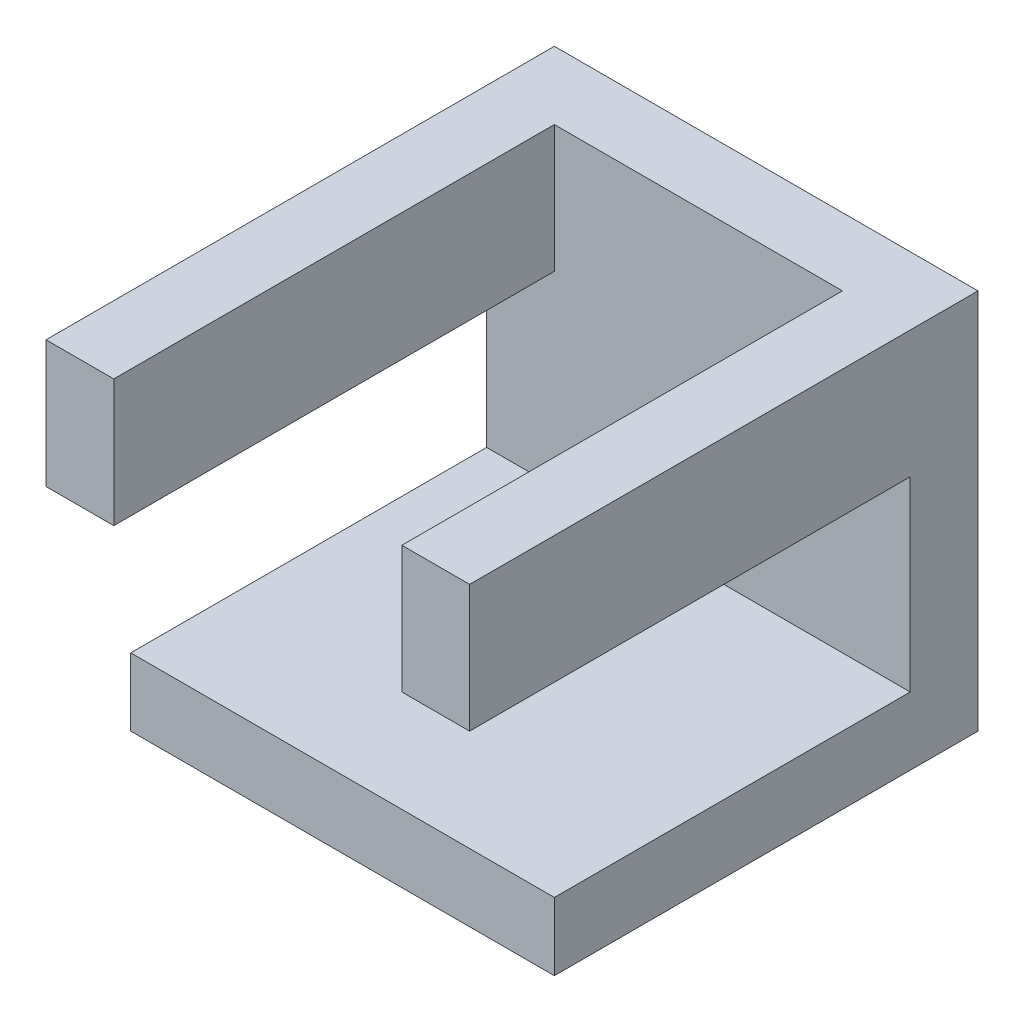
ISO-10303-21;
HEADER;
FILE_DESCRIPTION(('STEP AP214'),'2;1');
FILE_NAME('part.step','',(''),(''),'','','');
FILE_SCHEMA(('AUTOMOTIVE_DESIGN { 1 0 10303 214 1 1 1 1 }'));
ENDSEC;
DATA;
#1=APPLICATION_CONTEXT('core data for automotive mechanical design processes');
#2=APPLICATION_PROTOCOL_DEFINITION('international standard','automotive_design',2000,#1);
#3=PRODUCT_CONTEXT('',#1,'mechanical');
#4=PRODUCT('Part','Part','',(#3));
#5=PRODUCT_RELATED_PRODUCT_CATEGORY('part','',(#4));
#6=PRODUCT_DEFINITION_FORMATION('','',#4);
#7=PRODUCT_DEFINITION_CONTEXT('part definition',#1,'design');
#8=PRODUCT_DEFINITION('design','',#6,#7);
#9=PRODUCT_DEFINITION_SHAPE('','',#8);
#10=(LENGTH_UNIT() NAMED_UNIT(*) SI_UNIT(.MILLI.,.METRE.));
#11=(NAMED_UNIT(*) PLANE_ANGLE_UNIT() SI_UNIT($,.RADIAN.));
#12=(NAMED_UNIT(*) SI_UNIT($,.STERADIAN.) SOLID_ANGLE_UNIT());
#13=UNCERTAINTY_MEASURE_WITH_UNIT(LENGTH_MEASURE(1.E-05),#10,'distance_accuracy_value','');
#14=(GEOMETRIC_REPRESENTATION_CONTEXT(3) GLOBAL_UNCERTAINTY_ASSIGNED_CONTEXT((#13)) GLOBAL_UNIT_ASSIGNED_CONTEXT((#10,
#11,#12)) REPRESENTATION_CONTEXT('',''));
#15=CARTESIAN_POINT('',(0.,0.,0.));
#16=DIRECTION('',(0.,0.,1.));
#17=DIRECTION('',(1.,0.,0.));
#18=AXIS2_PLACEMENT_3D('',#15,#16,#17);
#19=CARTESIAN_POINT('',(0.,0.,80.));
#20=DIRECTION('',(0.,0.,-1.));
#21=DIRECTION('',(-1.,0.,0.));
#22=AXIS2_PLACEMENT_3D('',#19,#20,#21);
#23=PLANE('',#22);
#24=DIRECTION('',(0.,-1.,0.));
#25=VECTOR('',#24,1.);
#26=CARTESIAN_POINT('',(170.,0.,80.));
#27=LINE('',#26,#25);
#28=CARTESIAN_POINT('',(170.,225.,80.));
#29=VERTEX_POINT('',#28);
#30=CARTESIAN_POINT('',(170.,75.,80.));
#31=VERTEX_POINT('',#30);
#32=EDGE_CURVE('E60',#29,#31,#27,.T.);
#33=ORIENTED_EDGE('',*,*,#32,.F.);
#34=DIRECTION('',(-1.,0.,0.));
#35=VECTOR('',#34,1.);
#36=CARTESIAN_POINT('',(-250.,225.,80.));
#37=LINE('',#36,#35);
#38=CARTESIAN_POINT('',(-170.,225.,80.));
#39=VERTEX_POINT('',#38);
#40=EDGE_CURVE('E208',#29,#39,#37,.T.);
#41=ORIENTED_EDGE('',*,*,#40,.T.);
#42=DIRECTION('',(0.,1.,0.));
#43=VECTOR('',#42,1.);
#44=CARTESIAN_POINT('',(-170.,0.,80.));
#45=LINE('',#44,#43);
#46=CARTESIAN_POINT('',(-170.,75.,80.));
#47=VERTEX_POINT('',#46);
#48=EDGE_CURVE('E183',#47,#39,#45,.T.);
#49=ORIENTED_EDGE('',*,*,#48,.F.);
#50=DIRECTION('',(1.,0.,0.));
#51=VECTOR('',#50,1.);
#52=CARTESIAN_POINT('',(0.,75.,80.));
#53=LINE('',#52,#51);
#54=CARTESIAN_POINT('',(-250.,75.,80.));
#55=VERTEX_POINT('',#54);
#56=EDGE_CURVE('E180',#55,#47,#53,.T.);
#57=ORIENTED_EDGE('',*,*,#56,.F.);
#58=DIRECTION('',(0.,-1.,0.));
#59=VECTOR('',#58,1.);
#60=CARTESIAN_POINT('',(-250.,-225.,80.));
#61=LINE('',#60,#59);
#62=CARTESIAN_POINT('',(-250.,-145.,80.));
#63=VERTEX_POINT('',#62);
#64=EDGE_CURVE('E211',#55,#63,#61,.T.);
#65=ORIENTED_EDGE('',*,*,#64,.T.);
#66=DIRECTION('',(-1.,0.,0.));
#67=VECTOR('',#66,1.);
#68=CARTESIAN_POINT('',(0.,-145.,80.));
#69=LINE('',#68,#67);
#70=CARTESIAN_POINT('',(250.,-145.,80.));
#71=VERTEX_POINT('',#70);
#72=EDGE_CURVE('E203',#71,#63,#69,.T.);
#73=ORIENTED_EDGE('',*,*,#72,.F.);
#74=DIRECTION('',(0.,1.,0.));
#75=VECTOR('',#74,1.);
#76=CARTESIAN_POINT('',(250.,-225.,80.));
#77=LINE('',#76,#75);
#78=CARTESIAN_POINT('',(250.,75.,80.));
#79=VERTEX_POINT('',#78);
#80=EDGE_CURVE('E206',#71,#79,#77,.T.);
#81=ORIENTED_EDGE('',*,*,#80,.T.);
#82=DIRECTION('',(1.,0.,0.));
#83=VECTOR('',#82,1.);
#84=CARTESIAN_POINT('',(0.,75.,80.));
#85=LINE('',#84,#83);
#86=EDGE_CURVE('E56',#31,#79,#85,.T.);
#87=ORIENTED_EDGE('',*,*,#86,.F.);
#88=EDGE_LOOP('',(#33,#41,#49,#57,#65,#73,#81,#87));
#89=FACE_BOUND('',#88,.T.);
#90=ADVANCED_FACE('F41',(#89),#23,.F.);
#91=CARTESIAN_POINT('',(250.,-225.,80.));
#92=DIRECTION('',(-1.,0.,0.));
#93=DIRECTION('',(0.,0.,1.));
#94=AXIS2_PLACEMENT_3D('',#91,#92,#93);
#95=PLANE('',#94);
#96=DIRECTION('',(0.,0.,-1.));
#97=VECTOR('',#96,1.);
#98=CARTESIAN_POINT('',(250.,225.,80.));
#99=LINE('',#98,#97);
#100=CARTESIAN_POINT('',(250.,225.,600.));
#101=VERTEX_POINT('',#100);
#102=CARTESIAN_POINT('',(250.,225.,0.));
#103=VERTEX_POINT('',#102);
#104=EDGE_CURVE('E11',#101,#103,#99,.T.);
#105=ORIENTED_EDGE('',*,*,#104,.F.);
#106=DIRECTION('',(0.,1.,0.));
#107=VECTOR('',#106,1.);
#108=CARTESIAN_POINT('',(250.,75.,600.));
#109=LINE('',#108,#107);
#110=CARTESIAN_POINT('',(250.,75.,600.));
#111=VERTEX_POINT('',#110);
#112=EDGE_CURVE('E130',#111,#101,#109,.T.);
#113=ORIENTED_EDGE('',*,*,#112,.F.);
#114=DIRECTION('',(0.,0.,-1.));
#115=VECTOR('',#114,1.);
#116=CARTESIAN_POINT('',(250.,75.,600.));
#117=LINE('',#116,#115);
#118=EDGE_CURVE('E153',#111,#79,#117,.T.);
#119=ORIENTED_EDGE('',*,*,#118,.T.);
#120=ORIENTED_EDGE('',*,*,#80,.F.);
#121=DIRECTION('',(0.,0.,-1.));
#122=VECTOR('',#121,1.);
#123=CARTESIAN_POINT('',(250.,-145.,500.));
#124=LINE('',#123,#122);
#125=CARTESIAN_POINT('',(250.,-145.,500.));
#126=VERTEX_POINT('',#125);
#127=EDGE_CURVE('E200',#126,#71,#124,.T.);
#128=ORIENTED_EDGE('',*,*,#127,.F.);
#129=DIRECTION('',(0.,1.,0.));
#130=VECTOR('',#129,1.);
#131=CARTESIAN_POINT('',(250.,-225.,500.));
#132=LINE('',#131,#130);
#133=CARTESIAN_POINT('',(250.,-225.,500.));
#134=VERTEX_POINT('',#133);
#135=EDGE_CURVE('E186',#134,#126,#132,.T.);
#136=ORIENTED_EDGE('',*,*,#135,.F.);
#137=DIRECTION('',(0.,0.,-1.));
#138=VECTOR('',#137,1.);
#139=CARTESIAN_POINT('',(250.,-225.,80.));
#140=LINE('',#139,#138);
#141=CARTESIAN_POINT('',(250.,-225.,0.));
#142=VERTEX_POINT('',#141);
#143=EDGE_CURVE('E213',#134,#142,#140,.T.);
#144=ORIENTED_EDGE('',*,*,#143,.T.);
#145=DIRECTION('',(0.,1.,0.));
#146=VECTOR('',#145,1.);
#147=CARTESIAN_POINT('',(250.,-225.,0.));
#148=LINE('',#147,#146);
#149=EDGE_CURVE('E133',#142,#103,#148,.T.);
#150=ORIENTED_EDGE('',*,*,#149,.T.);
#151=EDGE_LOOP('',(#105,#113,#119,#120,#128,#136,#144,#150));
#152=FACE_BOUND('',#151,.T.);
#153=ADVANCED_FACE('F43',(#152),#95,.F.);
#154=CARTESIAN_POINT('',(-250.,225.,80.));
#155=DIRECTION('',(0.,-1.,0.));
#156=DIRECTION('',(0.,0.,-1.));
#157=AXIS2_PLACEMENT_3D('',#154,#155,#156);
#158=PLANE('',#157);
#159=DIRECTION('',(-1.,0.,0.));
#160=VECTOR('',#159,1.);
#161=CARTESIAN_POINT('',(-250.,225.,0.));
#162=LINE('',#161,#160);
#163=CARTESIAN_POINT('',(-250.,225.,0.));
#164=VERTEX_POINT('',#163);
#165=EDGE_CURVE('E215',#103,#164,#162,.T.);
#166=ORIENTED_EDGE('',*,*,#165,.T.);
#167=DIRECTION('',(0.,0.,-1.));
#168=VECTOR('',#167,1.);
#169=CARTESIAN_POINT('',(-250.,225.,80.));
#170=LINE('',#169,#168);
#171=CARTESIAN_POINT('',(-250.,225.,600.));
#172=VERTEX_POINT('',#171);
#173=EDGE_CURVE('E49',#172,#164,#170,.T.);
#174=ORIENTED_EDGE('',*,*,#173,.F.);
#175=DIRECTION('',(-1.,0.,0.));
#176=VECTOR('',#175,1.);
#177=CARTESIAN_POINT('',(-250.,225.,600.));
#178=LINE('',#177,#176);
#179=CARTESIAN_POINT('',(-170.,225.,600.));
#180=VERTEX_POINT('',#179);
#181=EDGE_CURVE('E164',#180,#172,#178,.T.);
#182=ORIENTED_EDGE('',*,*,#181,.F.);
#183=DIRECTION('',(0.,0.,-1.));
#184=VECTOR('',#183,1.);
#185=CARTESIAN_POINT('',(-170.,225.,600.));
#186=LINE('',#185,#184);
#187=EDGE_CURVE('E177',#180,#39,#186,.T.);
#188=ORIENTED_EDGE('',*,*,#187,.T.);
#189=ORIENTED_EDGE('',*,*,#40,.F.);
#190=DIRECTION('',(0.,0.,-1.));
#191=VECTOR('',#190,1.);
#192=CARTESIAN_POINT('',(170.,225.,600.));
#193=LINE('',#192,#191);
#194=CARTESIAN_POINT('',(170.,225.,600.));
#195=VERTEX_POINT('',#194);
#196=EDGE_CURVE('E140',#195,#29,#193,.T.);
#197=ORIENTED_EDGE('',*,*,#196,.F.);
#198=DIRECTION('',(-1.,0.,0.));
#199=VECTOR('',#198,1.);
#200=CARTESIAN_POINT('',(170.,225.,600.));
#201=LINE('',#200,#199);
#202=EDGE_CURVE('E137',#101,#195,#201,.T.);
#203=ORIENTED_EDGE('',*,*,#202,.F.);
#204=ORIENTED_EDGE('',*,*,#104,.T.);
#205=EDGE_LOOP('',(#166,#174,#182,#188,#189,#197,#203,#204));
#206=FACE_BOUND('',#205,.T.);
#207=ADVANCED_FACE('F138',(#206),#158,.F.);
#208=CARTESIAN_POINT('',(-250.,-225.,80.));
#209=DIRECTION('',(1.,0.,0.));
#210=DIRECTION('',(0.,0.,-1.));
#211=AXIS2_PLACEMENT_3D('',#208,#209,#210);
#212=PLANE('',#211);
#213=DIRECTION('',(0.,-1.,0.));
#214=VECTOR('',#213,1.);
#215=CARTESIAN_POINT('',(-250.,-225.,0.));
#216=LINE('',#215,#214);
#217=CARTESIAN_POINT('',(-250.,-225.,0.));
#218=VERTEX_POINT('',#217);
#219=EDGE_CURVE('E217',#164,#218,#216,.T.);
#220=ORIENTED_EDGE('',*,*,#219,.T.);
#221=DIRECTION('',(0.,0.,-1.));
#222=VECTOR('',#221,1.);
#223=CARTESIAN_POINT('',(-250.,-225.,80.));
#224=LINE('',#223,#222);
#225=CARTESIAN_POINT('',(-250.,-225.,500.));
#226=VERTEX_POINT('',#225);
#227=EDGE_CURVE('E221',#226,#218,#224,.T.);
#228=ORIENTED_EDGE('',*,*,#227,.F.);
#229=DIRECTION('',(0.,-1.,0.));
#230=VECTOR('',#229,1.);
#231=CARTESIAN_POINT('',(-250.,-225.,500.));
#232=LINE('',#231,#230);
#233=CARTESIAN_POINT('',(-250.,-145.,500.));
#234=VERTEX_POINT('',#233);
#235=EDGE_CURVE('E191',#234,#226,#232,.T.);
#236=ORIENTED_EDGE('',*,*,#235,.F.);
#237=DIRECTION('',(0.,0.,-1.));
#238=VECTOR('',#237,1.);
#239=CARTESIAN_POINT('',(-250.,-145.,500.));
#240=LINE('',#239,#238);
#241=EDGE_CURVE('E197',#234,#63,#240,.T.);
#242=ORIENTED_EDGE('',*,*,#241,.T.);
#243=ORIENTED_EDGE('',*,*,#64,.F.);
#244=DIRECTION('',(0.,0.,-1.));
#245=VECTOR('',#244,1.);
#246=CARTESIAN_POINT('',(-250.,75.,600.));
#247=LINE('',#246,#245);
#248=CARTESIAN_POINT('',(-250.,75.,600.));
#249=VERTEX_POINT('',#248);
#250=EDGE_CURVE('E174',#249,#55,#247,.T.);
#251=ORIENTED_EDGE('',*,*,#250,.F.);
#252=DIRECTION('',(0.,-1.,0.));
#253=VECTOR('',#252,1.);
#254=CARTESIAN_POINT('',(-250.,75.,600.));
#255=LINE('',#254,#253);
#256=EDGE_CURVE('E167',#172,#249,#255,.T.);
#257=ORIENTED_EDGE('',*,*,#256,.F.);
#258=ORIENTED_EDGE('',*,*,#173,.T.);
#259=EDGE_LOOP('',(#220,#228,#236,#242,#243,#251,#257,#258));
#260=FACE_BOUND('',#259,.T.);
#261=ADVANCED_FACE('F227',(#260),#212,.F.);
#262=CARTESIAN_POINT('',(-250.,-225.,80.));
#263=DIRECTION('',(0.,1.,0.));
#264=DIRECTION('',(0.,0.,1.));
#265=AXIS2_PLACEMENT_3D('',#262,#263,#264);
#266=PLANE('',#265);
#267=DIRECTION('',(1.,0.,0.));
#268=VECTOR('',#267,1.);
#269=CARTESIAN_POINT('',(-250.,-225.,0.));
#270=LINE('',#269,#268);
#271=EDGE_CURVE('E209',#218,#142,#270,.T.);
#272=ORIENTED_EDGE('',*,*,#271,.T.);
#273=ORIENTED_EDGE('',*,*,#143,.F.);
#274=DIRECTION('',(1.,0.,0.));
#275=VECTOR('',#274,1.);
#276=CARTESIAN_POINT('',(-250.,-225.,500.));
#277=LINE('',#276,#275);
#278=EDGE_CURVE('E194',#226,#134,#277,.T.);
#279=ORIENTED_EDGE('',*,*,#278,.F.);
#280=ORIENTED_EDGE('',*,*,#227,.T.);
#281=EDGE_LOOP('',(#272,#273,#279,#280));
#282=FACE_BOUND('',#281,.T.);
#283=ADVANCED_FACE('F233',(#282),#266,.F.);
#284=CARTESIAN_POINT('',(0.,0.,0.));
#285=DIRECTION('',(0.,0.,-1.));
#286=DIRECTION('',(-1.,0.,0.));
#287=AXIS2_PLACEMENT_3D('',#284,#285,#286);
#288=PLANE('',#287);
#289=ORIENTED_EDGE('',*,*,#219,.F.);
#290=ORIENTED_EDGE('',*,*,#165,.F.);
#291=ORIENTED_EDGE('',*,*,#149,.F.);
#292=ORIENTED_EDGE('',*,*,#271,.F.);
#293=EDGE_LOOP('',(#289,#290,#291,#292));
#294=FACE_BOUND('',#293,.T.);
#295=ADVANCED_FACE('F231',(#294),#288,.T.);
#296=CARTESIAN_POINT('',(-250.,-145.,500.));
#297=DIRECTION('',(0.,-1.,0.));
#298=DIRECTION('',(0.,0.,-1.));
#299=AXIS2_PLACEMENT_3D('',#296,#297,#298);
#300=PLANE('',#299);
#301=ORIENTED_EDGE('',*,*,#127,.T.);
#302=ORIENTED_EDGE('',*,*,#72,.T.);
#303=ORIENTED_EDGE('',*,*,#241,.F.);
#304=DIRECTION('',(-1.,0.,0.));
#305=VECTOR('',#304,1.);
#306=CARTESIAN_POINT('',(-250.,-145.,500.));
#307=LINE('',#306,#305);
#308=EDGE_CURVE('E189',#126,#234,#307,.T.);
#309=ORIENTED_EDGE('',*,*,#308,.F.);
#310=EDGE_LOOP('',(#301,#302,#303,#309));
#311=FACE_BOUND('',#310,.T.);
#312=ADVANCED_FACE('F244',(#311),#300,.F.);
#313=CARTESIAN_POINT('',(0.,0.,500.));
#314=DIRECTION('',(0.,0.,-1.));
#315=DIRECTION('',(-1.,0.,0.));
#316=AXIS2_PLACEMENT_3D('',#313,#314,#315);
#317=PLANE('',#316);
#318=ORIENTED_EDGE('',*,*,#135,.T.);
#319=ORIENTED_EDGE('',*,*,#308,.T.);
#320=ORIENTED_EDGE('',*,*,#235,.T.);
#321=ORIENTED_EDGE('',*,*,#278,.T.);
#322=EDGE_LOOP('',(#318,#319,#320,#321));
#323=FACE_BOUND('',#322,.T.);
#324=ADVANCED_FACE('F239',(#323),#317,.F.);
#325=CARTESIAN_POINT('',(-170.,75.,600.));
#326=DIRECTION('',(-1.,0.,0.));
#327=DIRECTION('',(0.,0.,1.));
#328=AXIS2_PLACEMENT_3D('',#325,#326,#327);
#329=PLANE('',#328);
#330=DIRECTION('',(0.,0.,-1.));
#331=VECTOR('',#330,1.);
#332=CARTESIAN_POINT('',(-170.,75.,600.));
#333=LINE('',#332,#331);
#334=CARTESIAN_POINT('',(-170.,75.,600.));
#335=VERTEX_POINT('',#334);
#336=EDGE_CURVE('E171',#335,#47,#333,.T.);
#337=ORIENTED_EDGE('',*,*,#336,.T.);
#338=ORIENTED_EDGE('',*,*,#48,.T.);
#339=ORIENTED_EDGE('',*,*,#187,.F.);
#340=DIRECTION('',(0.,1.,0.));
#341=VECTOR('',#340,1.);
#342=CARTESIAN_POINT('',(-170.,75.,600.));
#343=LINE('',#342,#341);
#344=EDGE_CURVE('E161',#335,#180,#343,.T.);
#345=ORIENTED_EDGE('',*,*,#344,.F.);
#346=EDGE_LOOP('',(#337,#338,#339,#345));
#347=FACE_BOUND('',#346,.T.);
#348=ADVANCED_FACE('F330',(#347),#329,.F.);
#349=CARTESIAN_POINT('',(-250.,75.,600.));
#350=DIRECTION('',(0.,1.,0.));
#351=DIRECTION('',(0.,0.,1.));
#352=AXIS2_PLACEMENT_3D('',#349,#350,#351);
#353=PLANE('',#352);
#354=ORIENTED_EDGE('',*,*,#250,.T.);
#355=ORIENTED_EDGE('',*,*,#56,.T.);
#356=ORIENTED_EDGE('',*,*,#336,.F.);
#357=DIRECTION('',(1.,0.,0.));
#358=VECTOR('',#357,1.);
#359=CARTESIAN_POINT('',(-250.,75.,600.));
#360=LINE('',#359,#358);
#361=EDGE_CURVE('E169',#249,#335,#360,.T.);
#362=ORIENTED_EDGE('',*,*,#361,.F.);
#363=EDGE_LOOP('',(#354,#355,#356,#362));
#364=FACE_BOUND('',#363,.T.);
#365=ADVANCED_FACE('F259',(#364),#353,.F.);
#366=CARTESIAN_POINT('',(0.,0.,600.));
#367=DIRECTION('',(0.,0.,-1.));
#368=DIRECTION('',(-1.,0.,0.));
#369=AXIS2_PLACEMENT_3D('',#366,#367,#368);
#370=PLANE('',#369);
#371=ORIENTED_EDGE('',*,*,#344,.T.);
#372=ORIENTED_EDGE('',*,*,#181,.T.);
#373=ORIENTED_EDGE('',*,*,#256,.T.);
#374=ORIENTED_EDGE('',*,*,#361,.T.);
#375=EDGE_LOOP('',(#371,#372,#373,#374));
#376=FACE_BOUND('',#375,.T.);
#377=ADVANCED_FACE('F251',(#376),#370,.F.);
#378=CARTESIAN_POINT('',(170.,75.,600.));
#379=DIRECTION('',(1.,0.,0.));
#380=DIRECTION('',(0.,0.,-1.));
#381=AXIS2_PLACEMENT_3D('',#378,#379,#380);
#382=PLANE('',#381);
#383=ORIENTED_EDGE('',*,*,#196,.T.);
#384=ORIENTED_EDGE('',*,*,#32,.T.);
#385=DIRECTION('',(0.,0.,-1.));
#386=VECTOR('',#385,1.);
#387=CARTESIAN_POINT('',(170.,75.,600.));
#388=LINE('',#387,#386);
#389=CARTESIAN_POINT('',(170.,75.,600.));
#390=VERTEX_POINT('',#389);
#391=EDGE_CURVE('E155',#390,#31,#388,.T.);
#392=ORIENTED_EDGE('',*,*,#391,.F.);
#393=DIRECTION('',(0.,-1.,0.));
#394=VECTOR('',#393,1.);
#395=CARTESIAN_POINT('',(170.,75.,600.));
#396=LINE('',#395,#394);
#397=EDGE_CURVE('E143',#195,#390,#396,.T.);
#398=ORIENTED_EDGE('',*,*,#397,.F.);
#399=EDGE_LOOP('',(#383,#384,#392,#398));
#400=FACE_BOUND('',#399,.T.);
#401=ADVANCED_FACE('F249',(#400),#382,.F.);
#402=CARTESIAN_POINT('',(170.,75.,600.));
#403=DIRECTION('',(0.,1.,0.));
#404=DIRECTION('',(0.,0.,1.));
#405=AXIS2_PLACEMENT_3D('',#402,#403,#404);
#406=PLANE('',#405);
#407=ORIENTED_EDGE('',*,*,#391,.T.);
#408=ORIENTED_EDGE('',*,*,#86,.T.);
#409=ORIENTED_EDGE('',*,*,#118,.F.);
#410=DIRECTION('',(1.,0.,0.));
#411=VECTOR('',#410,1.);
#412=CARTESIAN_POINT('',(170.,75.,600.));
#413=LINE('',#412,#411);
#414=EDGE_CURVE('E147',#390,#111,#413,.T.);
#415=ORIENTED_EDGE('',*,*,#414,.F.);
#416=EDGE_LOOP('',(#407,#408,#409,#415));
#417=FACE_BOUND('',#416,.T.);
#418=ADVANCED_FACE('F246',(#417),#406,.F.);
#419=CARTESIAN_POINT('',(0.,0.,600.));
#420=DIRECTION('',(0.,0.,-1.));
#421=DIRECTION('',(-1.,0.,0.));
#422=AXIS2_PLACEMENT_3D('',#419,#420,#421);
#423=PLANE('',#422);
#424=ORIENTED_EDGE('',*,*,#112,.T.);
#425=ORIENTED_EDGE('',*,*,#202,.T.);
#426=ORIENTED_EDGE('',*,*,#397,.T.);
#427=ORIENTED_EDGE('',*,*,#414,.T.);
#428=EDGE_LOOP('',(#424,#425,#426,#427));
#429=FACE_BOUND('',#428,.T.);
#430=ADVANCED_FACE('F145',(#429),#423,.F.);
#431=CLOSED_SHELL('',(#90,#153,#207,#261,#283,#295,#312,#324,#348,#365,#377,#401,#418,#430));
#432=MANIFOLD_SOLID_BREP('B2',#431);
#433=ADVANCED_BREP_SHAPE_REPRESENTATION('',(#18,#432),#14);
#434=SHAPE_DEFINITION_REPRESENTATION(#9,#433);
ENDSEC;
END-ISO-10303-21;
